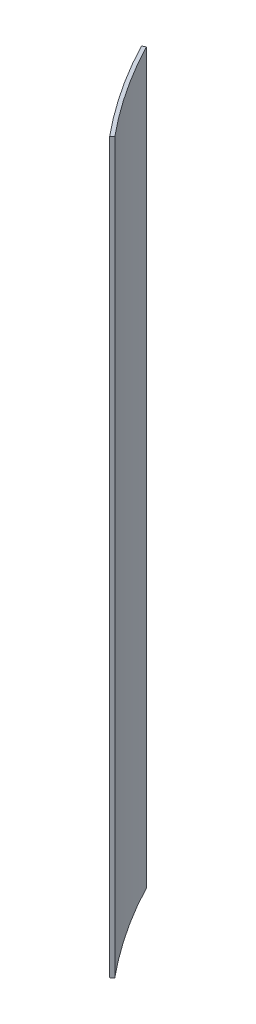
ISO-10303-21;
HEADER;
FILE_DESCRIPTION(('STEP AP214'),'2;1');
FILE_NAME('part.step','',(''),(''),'','','');
FILE_SCHEMA(('AUTOMOTIVE_DESIGN { 1 0 10303 214 1 1 1 1 }'));
ENDSEC;
DATA;
#1=APPLICATION_CONTEXT('core data for automotive mechanical design processes');
#2=APPLICATION_PROTOCOL_DEFINITION('international standard','automotive_design',2000,#1);
#3=PRODUCT_CONTEXT('',#1,'mechanical');
#4=PRODUCT('Part','Part','',(#3));
#5=PRODUCT_RELATED_PRODUCT_CATEGORY('part','',(#4));
#6=PRODUCT_DEFINITION_FORMATION('','',#4);
#7=PRODUCT_DEFINITION_CONTEXT('part definition',#1,'design');
#8=PRODUCT_DEFINITION('design','',#6,#7);
#9=PRODUCT_DEFINITION_SHAPE('','',#8);
#10=(LENGTH_UNIT() NAMED_UNIT(*) SI_UNIT(.MILLI.,.METRE.));
#11=(NAMED_UNIT(*) PLANE_ANGLE_UNIT() SI_UNIT($,.RADIAN.));
#12=(NAMED_UNIT(*) SI_UNIT($,.STERADIAN.) SOLID_ANGLE_UNIT());
#13=UNCERTAINTY_MEASURE_WITH_UNIT(LENGTH_MEASURE(1.E-05),#10,'distance_accuracy_value','');
#14=(GEOMETRIC_REPRESENTATION_CONTEXT(3) GLOBAL_UNCERTAINTY_ASSIGNED_CONTEXT((#13)) GLOBAL_UNIT_ASSIGNED_CONTEXT((#10,
#11,#12)) REPRESENTATION_CONTEXT('',''));
#15=CARTESIAN_POINT('',(0.,0.,0.));
#16=DIRECTION('',(0.,0.,1.));
#17=DIRECTION('',(1.,0.,0.));
#18=AXIS2_PLACEMENT_3D('',#15,#16,#17);
#19=CARTESIAN_POINT('',(0.,0.,0.));
#20=DIRECTION('',(0.,-1.,0.));
#21=DIRECTION('',(0.,0.,-1.));
#22=AXIS2_PLACEMENT_3D('',#19,#20,#21);
#23=PLANE('',#22);
#24=CARTESIAN_POINT('',(0.,0.,0.));
#25=DIRECTION('',(0.,-1.,0.));
#26=DIRECTION('',(0.,0.,-1.));
#27=AXIS2_PLACEMENT_3D('',#24,#25,#26);
#28=CIRCLE('',#27,1475.);
#29=CARTESIAN_POINT('',(-1137.82462938322,0.,938.605408448583));
#30=VERTEX_POINT('',#29);
#31=CARTESIAN_POINT('',(-1308.10746876827,0.,681.527585760598));
#32=VERTEX_POINT('',#31);
#33=EDGE_CURVE('E136',#30,#32,#28,.T.);
#34=ORIENTED_EDGE('',*,*,#33,.F.);
#35=DIRECTION('',(0.771406528395403,0.,-0.636342649795652));
#36=VECTOR('',#35,1.);
#37=CARTESIAN_POINT('',(-1145.53869466718,0.,944.96883494654));
#38=LINE('',#37,#36);
#39=CARTESIAN_POINT('',(-1145.53869466718,0.,944.96883494654));
#40=VERTEX_POINT('',#39);
#41=EDGE_CURVE('E84',#40,#30,#38,.T.);
#42=ORIENTED_EDGE('',*,*,#41,.F.);
#43=CARTESIAN_POINT('',(0.,0.,0.));
#44=DIRECTION('',(0.,1.,0.));
#45=DIRECTION('',(0.,0.,-1.));
#46=AXIS2_PLACEMENT_3D('',#43,#44,#45);
#47=CIRCLE('',#46,1485.);
#48=CARTESIAN_POINT('',(-1316.97599398026,0.,686.148111765755));
#49=VERTEX_POINT('',#48);
#50=EDGE_CURVE('E161',#49,#40,#47,.T.);
#51=ORIENTED_EDGE('',*,*,#50,.F.);
#52=DIRECTION('',(-0.886852521198826,0.,0.462052600515663));
#53=VECTOR('',#52,1.);
#54=CARTESIAN_POINT('',(-1316.97599398026,0.,686.148111765755));
#55=LINE('',#54,#53);
#56=EDGE_CURVE('E142',#32,#49,#55,.T.);
#57=ORIENTED_EDGE('',*,*,#56,.F.);
#58=EDGE_LOOP('',(#34,#42,#51,#57));
#59=FACE_BOUND('',#58,.T.);
#60=DIRECTION('',(0.876141512151698,0.,-0.482053991462093));
#61=VECTOR('',#60,1.);
#62=CARTESIAN_POINT('',(-1297.56557949661,0.,713.921961355456));
#63=LINE('',#62,#61);
#64=CARTESIAN_POINT('',(-1297.56557949661,0.,713.921961355456));
#65=VERTEX_POINT('',#64);
#66=CARTESIAN_POINT('',(-1295.81329647231,0.,712.957853372532));
#67=VERTEX_POINT('',#66);
#68=EDGE_CURVE('E130',#65,#67,#63,.T.);
#69=ORIENTED_EDGE('',*,*,#68,.T.);
#70=CARTESIAN_POINT('',(0.,0.,0.));
#71=DIRECTION('',(0.,-1.,0.));
#72=DIRECTION('',(0.,0.,1.));
#73=AXIS2_PLACEMENT_3D('',#70,#71,#72);
#74=CIRCLE('',#73,1479.);
#75=CARTESIAN_POINT('',(-1303.20818693158,0.,699.349284345459));
#76=VERTEX_POINT('',#75);
#77=EDGE_CURVE('E54',#67,#76,#74,.T.);
#78=ORIENTED_EDGE('',*,*,#77,.T.);
#79=DIRECTION('',(-0.881141438087636,0.,0.472852795365378));
#80=VECTOR('',#79,1.);
#81=CARTESIAN_POINT('',(-1303.20818693158,0.,699.349284345459));
#82=LINE('',#81,#80);
#83=CARTESIAN_POINT('',(-1304.97046980775,0.,700.294989936189));
#84=VERTEX_POINT('',#83);
#85=EDGE_CURVE('E134',#76,#84,#82,.T.);
#86=ORIENTED_EDGE('',*,*,#85,.T.);
#87=CARTESIAN_POINT('',(0.,0.,0.));
#88=DIRECTION('',(0.,1.,0.));
#89=DIRECTION('',(0.,0.,1.));
#90=AXIS2_PLACEMENT_3D('',#87,#88,#89);
#91=CIRCLE('',#90,1481.);
#92=EDGE_CURVE('E281',#84,#65,#91,.T.);
#93=ORIENTED_EDGE('',*,*,#92,.T.);
#94=EDGE_LOOP('',(#69,#78,#86,#93));
#95=FACE_BOUND('',#94,.T.);
#96=ADVANCED_FACE('F38',(#59,#95),#23,.T.);
#97=CARTESIAN_POINT('',(0.,2000.,0.));
#98=DIRECTION('',(0.,-1.,0.));
#99=DIRECTION('',(0.,0.,-1.));
#100=AXIS2_PLACEMENT_3D('',#97,#98,#99);
#101=CYLINDRICAL_SURFACE('',#100,1475.);
#102=ORIENTED_EDGE('',*,*,#33,.T.);
#103=DIRECTION('',(0.,-1.,0.));
#104=VECTOR('',#103,1.);
#105=CARTESIAN_POINT('',(-1308.10746876827,2000.,681.527585760598));
#106=LINE('',#105,#104);
#107=CARTESIAN_POINT('',(-1308.10746876827,2000.,681.527585760598));
#108=VERTEX_POINT('',#107);
#109=EDGE_CURVE('E11',#108,#32,#106,.T.);
#110=ORIENTED_EDGE('',*,*,#109,.F.);
#111=CARTESIAN_POINT('',(0.,2000.,0.));
#112=DIRECTION('',(0.,-1.,0.));
#113=DIRECTION('',(0.,0.,-1.));
#114=AXIS2_PLACEMENT_3D('',#111,#112,#113);
#115=CIRCLE('',#114,1475.);
#116=CARTESIAN_POINT('',(-1137.82462938322,2000.,938.605408448583));
#117=VERTEX_POINT('',#116);
#118=EDGE_CURVE('E148',#117,#108,#115,.T.);
#119=ORIENTED_EDGE('',*,*,#118,.F.);
#120=DIRECTION('',(0.,-1.,0.));
#121=VECTOR('',#120,1.);
#122=CARTESIAN_POINT('',(-1137.82462938322,2000.,938.605408448583));
#123=LINE('',#122,#121);
#124=EDGE_CURVE('E157',#117,#30,#123,.T.);
#125=ORIENTED_EDGE('',*,*,#124,.T.);
#126=EDGE_LOOP('',(#102,#110,#119,#125));
#127=FACE_BOUND('',#126,.T.);
#128=ADVANCED_FACE('F40',(#127),#101,.F.);
#129=CARTESIAN_POINT('',(-1316.97599398026,2000.,686.148111765755));
#130=DIRECTION('',(0.462052600515663,0.,0.886852521198826));
#131=DIRECTION('',(0.886852521198826,0.,-0.462052600515663));
#132=AXIS2_PLACEMENT_3D('',#129,#130,#131);
#133=PLANE('',#132);
#134=ORIENTED_EDGE('',*,*,#56,.T.);
#135=DIRECTION('',(0.,-1.,0.));
#136=VECTOR('',#135,1.);
#137=CARTESIAN_POINT('',(-1316.97599398026,2000.,686.148111765755));
#138=LINE('',#137,#136);
#139=CARTESIAN_POINT('',(-1316.97599398026,2000.,686.148111765755));
#140=VERTEX_POINT('',#139);
#141=EDGE_CURVE('E47',#140,#49,#138,.T.);
#142=ORIENTED_EDGE('',*,*,#141,.F.);
#143=DIRECTION('',(-0.886852521198826,0.,0.462052600515663));
#144=VECTOR('',#143,1.);
#145=CARTESIAN_POINT('',(-1316.97599398026,2000.,686.148111765755));
#146=LINE('',#145,#144);
#147=EDGE_CURVE('E91',#108,#140,#146,.T.);
#148=ORIENTED_EDGE('',*,*,#147,.F.);
#149=ORIENTED_EDGE('',*,*,#109,.T.);
#150=EDGE_LOOP('',(#134,#142,#148,#149));
#151=FACE_BOUND('',#150,.T.);
#152=ADVANCED_FACE('F192',(#151),#133,.F.);
#153=CARTESIAN_POINT('',(0.,2000.,0.));
#154=DIRECTION('',(0.,-1.,0.));
#155=DIRECTION('',(0.,0.,-1.));
#156=AXIS2_PLACEMENT_3D('',#153,#154,#155);
#157=CYLINDRICAL_SURFACE('',#156,1485.);
#158=ORIENTED_EDGE('',*,*,#50,.T.);
#159=DIRECTION('',(0.,-1.,0.));
#160=VECTOR('',#159,1.);
#161=CARTESIAN_POINT('',(-1145.53869466718,2000.,944.96883494654));
#162=LINE('',#161,#160);
#163=CARTESIAN_POINT('',(-1145.53869466718,2000.,944.96883494654));
#164=VERTEX_POINT('',#163);
#165=EDGE_CURVE('E168',#164,#40,#162,.T.);
#166=ORIENTED_EDGE('',*,*,#165,.F.);
#167=CARTESIAN_POINT('',(0.,2000.,0.));
#168=DIRECTION('',(0.,1.,0.));
#169=DIRECTION('',(0.,0.,-1.));
#170=AXIS2_PLACEMENT_3D('',#167,#168,#169);
#171=CIRCLE('',#170,1485.);
#172=EDGE_CURVE('E153',#140,#164,#171,.T.);
#173=ORIENTED_EDGE('',*,*,#172,.F.);
#174=ORIENTED_EDGE('',*,*,#141,.T.);
#175=EDGE_LOOP('',(#158,#166,#173,#174));
#176=FACE_BOUND('',#175,.T.);
#177=ADVANCED_FACE('F175',(#176),#157,.T.);
#178=CARTESIAN_POINT('',(-1145.53869466718,2000.,944.96883494654));
#179=DIRECTION('',(-0.636342649795652,0.,-0.771406528395403));
#180=DIRECTION('',(-0.771406528395403,0.,0.636342649795652));
#181=AXIS2_PLACEMENT_3D('',#178,#179,#180);
#182=PLANE('',#181);
#183=ORIENTED_EDGE('',*,*,#41,.T.);
#184=ORIENTED_EDGE('',*,*,#124,.F.);
#185=DIRECTION('',(0.771406528395403,0.,-0.636342649795652));
#186=VECTOR('',#185,1.);
#187=CARTESIAN_POINT('',(-1145.53869466718,2000.,944.96883494654));
#188=LINE('',#187,#186);
#189=EDGE_CURVE('E63',#164,#117,#188,.T.);
#190=ORIENTED_EDGE('',*,*,#189,.F.);
#191=ORIENTED_EDGE('',*,*,#165,.T.);
#192=EDGE_LOOP('',(#183,#184,#190,#191));
#193=FACE_BOUND('',#192,.T.);
#194=ADVANCED_FACE('F183',(#193),#182,.F.);
#195=CARTESIAN_POINT('',(0.,2000.,0.));
#196=DIRECTION('',(0.,-1.,0.));
#197=DIRECTION('',(0.,0.,-1.));
#198=AXIS2_PLACEMENT_3D('',#195,#196,#197);
#199=PLANE('',#198);
#200=ORIENTED_EDGE('',*,*,#118,.T.);
#201=ORIENTED_EDGE('',*,*,#147,.T.);
#202=ORIENTED_EDGE('',*,*,#172,.T.);
#203=ORIENTED_EDGE('',*,*,#189,.T.);
#204=EDGE_LOOP('',(#200,#201,#202,#203));
#205=FACE_BOUND('',#204,.T.);
#206=ADVANCED_FACE('F185',(#205),#199,.F.);
#207=CARTESIAN_POINT('',(0.,30.,0.));
#208=DIRECTION('',(0.,-1.,0.));
#209=DIRECTION('',(0.,0.,-1.));
#210=AXIS2_PLACEMENT_3D('',#207,#208,#209);
#211=CYLINDRICAL_SURFACE('',#210,1479.);
#212=ORIENTED_EDGE('',*,*,#77,.F.);
#213=DIRECTION('',(0.,-1.,0.));
#214=VECTOR('',#213,1.);
#215=CARTESIAN_POINT('',(-1295.81329647231,30.,712.957853372532));
#216=LINE('',#215,#214);
#217=CARTESIAN_POINT('',(-1295.81329647231,30.,712.957853372532));
#218=VERTEX_POINT('',#217);
#219=EDGE_CURVE('E128',#218,#67,#216,.T.);
#220=ORIENTED_EDGE('',*,*,#219,.F.);
#221=CARTESIAN_POINT('',(0.,30.,0.));
#222=DIRECTION('',(0.,-1.,0.));
#223=DIRECTION('',(0.,0.,1.));
#224=AXIS2_PLACEMENT_3D('',#221,#222,#223);
#225=CIRCLE('',#224,1479.);
#226=CARTESIAN_POINT('',(-1303.20818693158,30.,699.349284345459));
#227=VERTEX_POINT('',#226);
#228=EDGE_CURVE('E119',#218,#227,#225,.T.);
#229=ORIENTED_EDGE('',*,*,#228,.T.);
#230=DIRECTION('',(0.,-1.,0.));
#231=VECTOR('',#230,1.);
#232=CARTESIAN_POINT('',(-1303.20818693158,30.,699.349284345459));
#233=LINE('',#232,#231);
#234=EDGE_CURVE('E127',#227,#76,#233,.T.);
#235=ORIENTED_EDGE('',*,*,#234,.T.);
#236=EDGE_LOOP('',(#212,#220,#229,#235));
#237=FACE_BOUND('',#236,.T.);
#238=ADVANCED_FACE('F126',(#237),#211,.T.);
#239=CARTESIAN_POINT('',(-1303.20818693158,30.,699.349284345459));
#240=DIRECTION('',(0.472852795365378,0.,0.881141438087636));
#241=DIRECTION('',(0.881141438087636,0.,-0.472852795365378));
#242=AXIS2_PLACEMENT_3D('',#239,#240,#241);
#243=PLANE('',#242);
#244=ORIENTED_EDGE('',*,*,#85,.F.);
#245=ORIENTED_EDGE('',*,*,#234,.F.);
#246=DIRECTION('',(-0.881141438087636,0.,0.472852795365378));
#247=VECTOR('',#246,1.);
#248=CARTESIAN_POINT('',(-1303.20818693158,30.,699.349284345459));
#249=LINE('',#248,#247);
#250=CARTESIAN_POINT('',(-1304.97046980775,30.,700.294989936189));
#251=VERTEX_POINT('',#250);
#252=EDGE_CURVE('E115',#227,#251,#249,.T.);
#253=ORIENTED_EDGE('',*,*,#252,.T.);
#254=DIRECTION('',(0.,-1.,0.));
#255=VECTOR('',#254,1.);
#256=CARTESIAN_POINT('',(-1304.97046980775,30.,700.294989936189));
#257=LINE('',#256,#255);
#258=EDGE_CURVE('E137',#251,#84,#257,.T.);
#259=ORIENTED_EDGE('',*,*,#258,.T.);
#260=EDGE_LOOP('',(#244,#245,#253,#259));
#261=FACE_BOUND('',#260,.T.);
#262=ADVANCED_FACE('F132',(#261),#243,.T.);
#263=CARTESIAN_POINT('',(0.,30.,0.));
#264=DIRECTION('',(0.,-1.,0.));
#265=DIRECTION('',(0.,0.,-1.));
#266=AXIS2_PLACEMENT_3D('',#263,#264,#265);
#267=CYLINDRICAL_SURFACE('',#266,1481.);
#268=ORIENTED_EDGE('',*,*,#92,.F.);
#269=ORIENTED_EDGE('',*,*,#258,.F.);
#270=CARTESIAN_POINT('',(0.,30.,0.));
#271=DIRECTION('',(0.,1.,0.));
#272=DIRECTION('',(0.,0.,1.));
#273=AXIS2_PLACEMENT_3D('',#270,#271,#272);
#274=CIRCLE('',#273,1481.);
#275=CARTESIAN_POINT('',(-1297.56557949661,30.,713.921961355456));
#276=VERTEX_POINT('',#275);
#277=EDGE_CURVE('E120',#251,#276,#274,.T.);
#278=ORIENTED_EDGE('',*,*,#277,.T.);
#279=DIRECTION('',(0.,-1.,0.));
#280=VECTOR('',#279,1.);
#281=CARTESIAN_POINT('',(-1297.56557949661,30.,713.921961355456));
#282=LINE('',#281,#280);
#283=EDGE_CURVE('E144',#276,#65,#282,.T.);
#284=ORIENTED_EDGE('',*,*,#283,.T.);
#285=EDGE_LOOP('',(#268,#269,#278,#284));
#286=FACE_BOUND('',#285,.T.);
#287=ADVANCED_FACE('F206',(#286),#267,.F.);
#288=CARTESIAN_POINT('',(-1297.56557949661,30.,713.921961355456));
#289=DIRECTION('',(-0.482053991462093,0.,-0.876141512151698));
#290=DIRECTION('',(-0.876141512151699,0.,0.482053991462093));
#291=AXIS2_PLACEMENT_3D('',#288,#289,#290);
#292=PLANE('',#291);
#293=ORIENTED_EDGE('',*,*,#68,.F.);
#294=ORIENTED_EDGE('',*,*,#283,.F.);
#295=DIRECTION('',(0.876141512151698,0.,-0.482053991462093));
#296=VECTOR('',#295,1.);
#297=CARTESIAN_POINT('',(-1297.56557949661,30.,713.921961355456));
#298=LINE('',#297,#296);
#299=EDGE_CURVE('E291',#276,#218,#298,.T.);
#300=ORIENTED_EDGE('',*,*,#299,.T.);
#301=ORIENTED_EDGE('',*,*,#219,.T.);
#302=EDGE_LOOP('',(#293,#294,#300,#301));
#303=FACE_BOUND('',#302,.T.);
#304=ADVANCED_FACE('F209',(#303),#292,.T.);
#305=CARTESIAN_POINT('',(0.,30.,0.));
#306=DIRECTION('',(0.,1.,0.));
#307=DIRECTION('',(0.,0.,1.));
#308=AXIS2_PLACEMENT_3D('',#305,#306,#307);
#309=PLANE('',#308);
#310=ORIENTED_EDGE('',*,*,#228,.F.);
#311=ORIENTED_EDGE('',*,*,#299,.F.);
#312=ORIENTED_EDGE('',*,*,#277,.F.);
#313=ORIENTED_EDGE('',*,*,#252,.F.);
#314=EDGE_LOOP('',(#310,#311,#312,#313));
#315=FACE_BOUND('',#314,.T.);
#316=ADVANCED_FACE('F117',(#315),#309,.F.);
#317=CLOSED_SHELL('',(#96,#128,#152,#177,#194,#206,#238,#262,#287,#304,#316));
#318=MANIFOLD_SOLID_BREP('B2',#317);
#319=ADVANCED_BREP_SHAPE_REPRESENTATION('',(#18,#318),#14);
#320=SHAPE_DEFINITION_REPRESENTATION(#9,#319);
ENDSEC;
END-ISO-10303-21;
